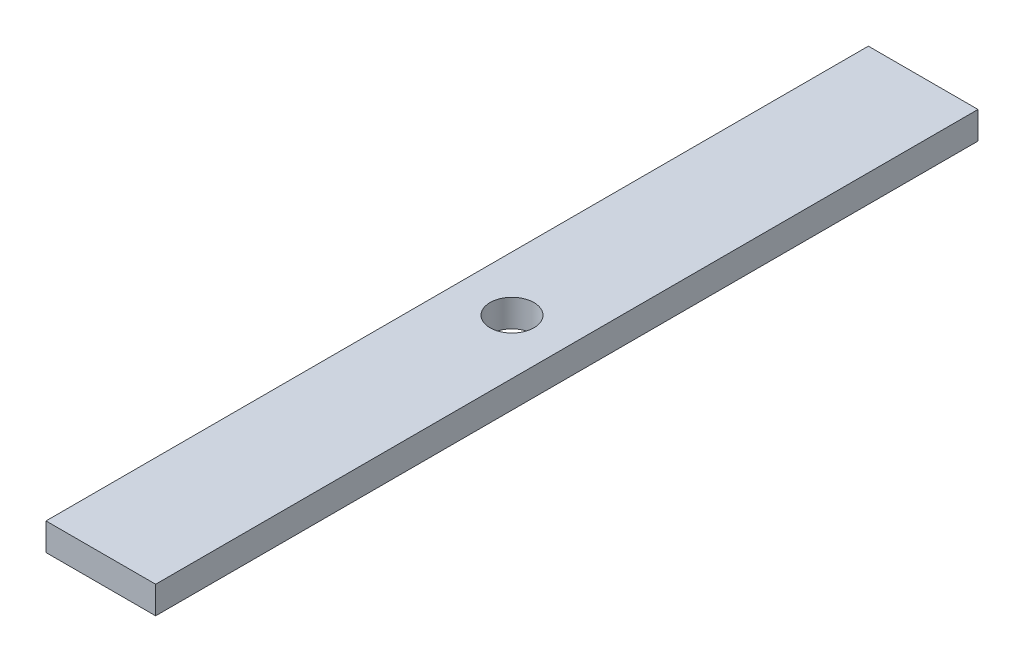
ISO-10303-21;
HEADER;
FILE_DESCRIPTION(('STEP AP214'),'2;1');
FILE_NAME('part.step','',(''),(''),'','','');
FILE_SCHEMA(('AUTOMOTIVE_DESIGN { 1 0 10303 214 1 1 1 1 }'));
ENDSEC;
DATA;
#1=APPLICATION_CONTEXT('core data for automotive mechanical design processes');
#2=APPLICATION_PROTOCOL_DEFINITION('international standard','automotive_design',2000,#1);
#3=PRODUCT_CONTEXT('',#1,'mechanical');
#4=PRODUCT('Part','Part','',(#3));
#5=PRODUCT_RELATED_PRODUCT_CATEGORY('part','',(#4));
#6=PRODUCT_DEFINITION_FORMATION('','',#4);
#7=PRODUCT_DEFINITION_CONTEXT('part definition',#1,'design');
#8=PRODUCT_DEFINITION('design','',#6,#7);
#9=PRODUCT_DEFINITION_SHAPE('','',#8);
#10=(LENGTH_UNIT() NAMED_UNIT(*) SI_UNIT(.MILLI.,.METRE.));
#11=(NAMED_UNIT(*) PLANE_ANGLE_UNIT() SI_UNIT($,.RADIAN.));
#12=(NAMED_UNIT(*) SI_UNIT($,.STERADIAN.) SOLID_ANGLE_UNIT());
#13=UNCERTAINTY_MEASURE_WITH_UNIT(LENGTH_MEASURE(1.E-05),#10,'distance_accuracy_value','');
#14=(GEOMETRIC_REPRESENTATION_CONTEXT(3) GLOBAL_UNCERTAINTY_ASSIGNED_CONTEXT((#13)) GLOBAL_UNIT_ASSIGNED_CONTEXT((#10,
#11,#12)) REPRESENTATION_CONTEXT('',''));
#15=CARTESIAN_POINT('',(0.,0.,0.));
#16=DIRECTION('',(0.,0.,1.));
#17=DIRECTION('',(1.,0.,0.));
#18=AXIS2_PLACEMENT_3D('',#15,#16,#17);
#19=CARTESIAN_POINT('',(-10.,2.5,106.));
#20=DIRECTION('',(1.,0.,0.));
#21=DIRECTION('',(0.,0.,-1.));
#22=AXIS2_PLACEMENT_3D('',#19,#20,#21);
#23=PLANE('',#22);
#24=DIRECTION('',(0.,-1.,0.));
#25=VECTOR('',#24,1.);
#26=CARTESIAN_POINT('',(-10.,2.5,75.));
#27=LINE('',#26,#25);
#28=CARTESIAN_POINT('',(-10.,2.5,75.));
#29=VERTEX_POINT('',#28);
#30=CARTESIAN_POINT('',(-10.,-2.5,75.));
#31=VERTEX_POINT('',#30);
#32=EDGE_CURVE('E73',#29,#31,#27,.T.);
#33=ORIENTED_EDGE('',*,*,#32,.F.);
#34=DIRECTION('',(0.,0.,-1.));
#35=VECTOR('',#34,1.);
#36=CARTESIAN_POINT('',(-10.,2.5,106.));
#37=LINE('',#36,#35);
#38=CARTESIAN_POINT('',(-10.,2.5,-75.));
#39=VERTEX_POINT('',#38);
#40=EDGE_CURVE('E85',#29,#39,#37,.T.);
#41=ORIENTED_EDGE('',*,*,#40,.T.);
#42=DIRECTION('',(0.,1.,0.));
#43=VECTOR('',#42,1.);
#44=CARTESIAN_POINT('',(-10.,2.5,-75.));
#45=LINE('',#44,#43);
#46=CARTESIAN_POINT('',(-10.,-2.5,-75.));
#47=VERTEX_POINT('',#46);
#48=EDGE_CURVE('E55',#47,#39,#45,.T.);
#49=ORIENTED_EDGE('',*,*,#48,.F.);
#50=DIRECTION('',(0.,0.,-1.));
#51=VECTOR('',#50,1.);
#52=CARTESIAN_POINT('',(-10.,-2.5,106.));
#53=LINE('',#52,#51);
#54=EDGE_CURVE('E12',#31,#47,#53,.T.);
#55=ORIENTED_EDGE('',*,*,#54,.F.);
#56=EDGE_LOOP('',(#33,#41,#49,#55));
#57=FACE_BOUND('',#56,.T.);
#58=ADVANCED_FACE('F33',(#57),#23,.F.);
#59=CARTESIAN_POINT('',(-10.,-2.5,106.));
#60=DIRECTION('',(0.,1.,0.));
#61=DIRECTION('',(-1.,0.,0.));
#62=AXIS2_PLACEMENT_3D('',#59,#60,#61);
#63=PLANE('',#62);
#64=CARTESIAN_POINT('',(0.,-2.5,0.));
#65=DIRECTION('',(0.,1.,0.));
#66=DIRECTION('',(-1.,0.,0.));
#67=AXIS2_PLACEMENT_3D('',#64,#65,#66);
#68=CIRCLE('',#67,4.);
#69=CARTESIAN_POINT('',(-4.,-2.5,0.));
#70=VERTEX_POINT('',#69);
#71=EDGE_CURVE('E90',#70,#70,#68,.T.);
#72=ORIENTED_EDGE('',*,*,#71,.T.);
#73=EDGE_LOOP('',(#72));
#74=FACE_BOUND('',#73,.T.);
#75=DIRECTION('',(1.,0.,0.));
#76=VECTOR('',#75,1.);
#77=CARTESIAN_POINT('',(-25.7525042215434,-2.5,75.));
#78=LINE('',#77,#76);
#79=CARTESIAN_POINT('',(9.99999999999998,-2.5,75.));
#80=VERTEX_POINT('',#79);
#81=EDGE_CURVE('E105',#31,#80,#78,.T.);
#82=ORIENTED_EDGE('',*,*,#81,.F.);
#83=ORIENTED_EDGE('',*,*,#54,.T.);
#84=DIRECTION('',(-1.,0.,0.));
#85=VECTOR('',#84,1.);
#86=CARTESIAN_POINT('',(-25.7525042215434,-2.5,-75.));
#87=LINE('',#86,#85);
#88=CARTESIAN_POINT('',(9.99999999999998,-2.5,-75.));
#89=VERTEX_POINT('',#88);
#90=EDGE_CURVE('E79',#89,#47,#87,.T.);
#91=ORIENTED_EDGE('',*,*,#90,.F.);
#92=DIRECTION('',(0.,0.,-1.));
#93=VECTOR('',#92,1.);
#94=CARTESIAN_POINT('',(10.,-2.5,106.));
#95=LINE('',#94,#93);
#96=EDGE_CURVE('E40',#80,#89,#95,.T.);
#97=ORIENTED_EDGE('',*,*,#96,.F.);
#98=EDGE_LOOP('',(#82,#83,#91,#97));
#99=FACE_BOUND('',#98,.T.);
#100=ADVANCED_FACE('F104',(#74,#99),#63,.F.);
#101=CARTESIAN_POINT('',(10.,2.5,106.));
#102=DIRECTION('',(-1.,0.,0.));
#103=DIRECTION('',(0.,0.,1.));
#104=AXIS2_PLACEMENT_3D('',#101,#102,#103);
#105=PLANE('',#104);
#106=DIRECTION('',(0.,1.,0.));
#107=VECTOR('',#106,1.);
#108=CARTESIAN_POINT('',(10.,2.5,75.));
#109=LINE('',#108,#107);
#110=CARTESIAN_POINT('',(10.,2.5,75.));
#111=VERTEX_POINT('',#110);
#112=EDGE_CURVE('E47',#80,#111,#109,.T.);
#113=ORIENTED_EDGE('',*,*,#112,.F.);
#114=ORIENTED_EDGE('',*,*,#96,.T.);
#115=DIRECTION('',(0.,-1.,0.));
#116=VECTOR('',#115,1.);
#117=CARTESIAN_POINT('',(10.,2.5,-75.));
#118=LINE('',#117,#116);
#119=CARTESIAN_POINT('',(9.99999999999998,2.5,-75.));
#120=VERTEX_POINT('',#119);
#121=EDGE_CURVE('E101',#120,#89,#118,.T.);
#122=ORIENTED_EDGE('',*,*,#121,.F.);
#123=DIRECTION('',(0.,0.,-1.));
#124=VECTOR('',#123,1.);
#125=CARTESIAN_POINT('',(10.,2.5,106.));
#126=LINE('',#125,#124);
#127=EDGE_CURVE('E89',#111,#120,#126,.T.);
#128=ORIENTED_EDGE('',*,*,#127,.F.);
#129=EDGE_LOOP('',(#113,#114,#122,#128));
#130=FACE_BOUND('',#129,.T.);
#131=ADVANCED_FACE('F100',(#130),#105,.F.);
#132=CARTESIAN_POINT('',(-10.,2.5,106.));
#133=DIRECTION('',(0.,-1.,0.));
#134=DIRECTION('',(1.,0.,0.));
#135=AXIS2_PLACEMENT_3D('',#132,#133,#134);
#136=PLANE('',#135);
#137=CARTESIAN_POINT('',(0.,2.5,0.));
#138=DIRECTION('',(0.,1.,0.));
#139=DIRECTION('',(-1.,0.,0.));
#140=AXIS2_PLACEMENT_3D('',#137,#138,#139);
#141=CIRCLE('',#140,4.);
#142=CARTESIAN_POINT('',(-4.,2.5,0.));
#143=VERTEX_POINT('',#142);
#144=EDGE_CURVE('E86',#143,#143,#141,.T.);
#145=ORIENTED_EDGE('',*,*,#144,.F.);
#146=EDGE_LOOP('',(#145));
#147=FACE_BOUND('',#146,.T.);
#148=DIRECTION('',(1.,0.,0.));
#149=VECTOR('',#148,1.);
#150=CARTESIAN_POINT('',(-25.7525042215434,2.5,75.));
#151=LINE('',#150,#149);
#152=EDGE_CURVE('E70',#29,#111,#151,.T.);
#153=ORIENTED_EDGE('',*,*,#152,.T.);
#154=ORIENTED_EDGE('',*,*,#127,.T.);
#155=DIRECTION('',(-1.,0.,0.));
#156=VECTOR('',#155,1.);
#157=CARTESIAN_POINT('',(-25.7525042215434,2.5,-75.));
#158=LINE('',#157,#156);
#159=EDGE_CURVE('E80',#120,#39,#158,.T.);
#160=ORIENTED_EDGE('',*,*,#159,.T.);
#161=ORIENTED_EDGE('',*,*,#40,.F.);
#162=EDGE_LOOP('',(#153,#154,#160,#161));
#163=FACE_BOUND('',#162,.T.);
#164=ADVANCED_FACE('F88',(#147,#163),#136,.F.);
#165=CARTESIAN_POINT('',(0.,-2.5,0.));
#166=DIRECTION('',(0.,1.,0.));
#167=DIRECTION('',(-1.,0.,0.));
#168=AXIS2_PLACEMENT_3D('',#165,#166,#167);
#169=CYLINDRICAL_SURFACE('',#168,4.);
#170=CARTESIAN_POINT('',(-4.,-2.5,0.));
#171=CARTESIAN_POINT('',(-4.,-2.44791666666667,0.));
#172=CARTESIAN_POINT('',(-4.,-2.39583333333333,0.));
#173=CARTESIAN_POINT('',(-4.,-2.29166666666667,0.));
#174=CARTESIAN_POINT('',(-4.,-2.23958333333333,0.));
#175=CARTESIAN_POINT('',(-4.,-2.13541666666667,0.));
#176=CARTESIAN_POINT('',(-4.,-2.08333333333333,0.));
#177=CARTESIAN_POINT('',(-4.,-1.97916666666667,0.));
#178=CARTESIAN_POINT('',(-4.,-1.92708333333333,0.));
#179=CARTESIAN_POINT('',(-4.,-1.82291666666667,0.));
#180=CARTESIAN_POINT('',(-4.,-1.77083333333333,0.));
#181=CARTESIAN_POINT('',(-4.,-1.66666666666667,0.));
#182=CARTESIAN_POINT('',(-4.,-1.61458333333333,0.));
#183=CARTESIAN_POINT('',(-4.,-1.51041666666667,0.));
#184=CARTESIAN_POINT('',(-4.,-1.45833333333333,0.));
#185=CARTESIAN_POINT('',(-4.,-1.35416666666667,0.));
#186=CARTESIAN_POINT('',(-4.,-1.30208333333333,0.));
#187=CARTESIAN_POINT('',(-4.,-1.19791666666667,0.));
#188=CARTESIAN_POINT('',(-4.,-1.14583333333333,0.));
#189=CARTESIAN_POINT('',(-4.,-1.04166666666667,0.));
#190=CARTESIAN_POINT('',(-4.,-0.989583333333334,0.));
#191=CARTESIAN_POINT('',(-4.,-0.885416666666667,0.));
#192=CARTESIAN_POINT('',(-4.,-0.833333333333334,0.));
#193=CARTESIAN_POINT('',(-4.,-0.729166666666667,0.));
#194=CARTESIAN_POINT('',(-4.,-0.677083333333334,0.));
#195=CARTESIAN_POINT('',(-4.,-0.572916666666667,0.));
#196=CARTESIAN_POINT('',(-4.,-0.520833333333334,0.));
#197=CARTESIAN_POINT('',(-4.,-0.416666666666667,0.));
#198=CARTESIAN_POINT('',(-4.,-0.364583333333334,0.));
#199=CARTESIAN_POINT('',(-4.,-0.260416666666667,0.));
#200=CARTESIAN_POINT('',(-4.,-0.208333333333334,0.));
#201=CARTESIAN_POINT('',(-4.,-0.104166666666667,0.));
#202=CARTESIAN_POINT('',(-4.,-0.0520833333333334,0.));
#203=CARTESIAN_POINT('',(-4.,0.0520833333333334,0.));
#204=CARTESIAN_POINT('',(-4.,0.104166666666667,0.));
#205=CARTESIAN_POINT('',(-4.,0.208333333333334,0.));
#206=CARTESIAN_POINT('',(-4.,0.260416666666667,0.));
#207=CARTESIAN_POINT('',(-4.,0.364583333333334,0.));
#208=CARTESIAN_POINT('',(-4.,0.416666666666667,0.));
#209=CARTESIAN_POINT('',(-4.,0.520833333333334,0.));
#210=CARTESIAN_POINT('',(-4.,0.572916666666667,0.));
#211=CARTESIAN_POINT('',(-4.,0.677083333333334,0.));
#212=CARTESIAN_POINT('',(-4.,0.729166666666667,0.));
#213=CARTESIAN_POINT('',(-4.,0.833333333333334,0.));
#214=CARTESIAN_POINT('',(-4.,0.885416666666667,0.));
#215=CARTESIAN_POINT('',(-4.,0.989583333333334,0.));
#216=CARTESIAN_POINT('',(-4.,1.04166666666667,0.));
#217=CARTESIAN_POINT('',(-4.,1.14583333333333,0.));
#218=CARTESIAN_POINT('',(-4.,1.19791666666667,0.));
#219=CARTESIAN_POINT('',(-4.,1.30208333333333,0.));
#220=CARTESIAN_POINT('',(-4.,1.35416666666667,0.));
#221=CARTESIAN_POINT('',(-4.,1.45833333333333,0.));
#222=CARTESIAN_POINT('',(-4.,1.51041666666667,0.));
#223=CARTESIAN_POINT('',(-4.,1.61458333333333,0.));
#224=CARTESIAN_POINT('',(-4.,1.66666666666667,0.));
#225=CARTESIAN_POINT('',(-4.,1.77083333333333,0.));
#226=CARTESIAN_POINT('',(-4.,1.82291666666667,0.));
#227=CARTESIAN_POINT('',(-4.,1.92708333333333,0.));
#228=CARTESIAN_POINT('',(-4.,1.97916666666667,0.));
#229=CARTESIAN_POINT('',(-4.,2.08333333333333,0.));
#230=CARTESIAN_POINT('',(-4.,2.13541666666667,0.));
#231=CARTESIAN_POINT('',(-4.,2.23958333333333,0.));
#232=CARTESIAN_POINT('',(-4.,2.29166666666667,0.));
#233=CARTESIAN_POINT('',(-4.,2.39583333333333,0.));
#234=CARTESIAN_POINT('',(-4.,2.44791666666667,0.));
#235=CARTESIAN_POINT('',(-4.,2.5,0.));
#236=B_SPLINE_CURVE_WITH_KNOTS('',3,(#170,#171,#172,#173,#174,#175,#176,#177,#178,#179,#180,
#181,#182,#183,#184,#185,#186,#187,#188,#189,#190,#191,#192,#193,#194,#195,#196,#197,#198,#199,
#200,#201,#202,#203,#204,#205,#206,#207,#208,#209,#210,#211,#212,#213,#214,#215,#216,#217,#218,
#219,#220,#221,#222,#223,#224,#225,#226,#227,#228,#229,#230,#231,#232,#233,#234,#235),
.UNSPECIFIED.,.F.,.F.,(4,2,2,2,2,2,2,2,2,2,2,2,2,2,2,2,2,2,2,2,2,2,2,2,2,2,2,2,2,2,2,2,4),(0.,
0.15625,0.3125,0.46875,0.625,0.78125,0.9375,1.09375,1.25,1.40625,1.5625,1.71875,1.875,2.03125,
2.1875,2.34375,2.5,2.65625,2.8125,2.96875,3.125,3.28125,3.4375,3.59375,3.75,3.90625,4.0625,
4.21875,4.375,4.53125,4.6875,4.84375,5.),.UNSPECIFIED.);
#237=EDGE_CURVE('BSEAM114',#70,#143,#236,.T.);
#238=ORIENTED_EDGE('',*,*,#71,.F.);
#239=ORIENTED_EDGE('',*,*,#144,.T.);
#240=ORIENTED_EDGE('',*,*,#237,.T.);
#241=ORIENTED_EDGE('',*,*,#237,.F.);
#242=EDGE_LOOP('',(#238,#240,#239,#241));
#243=FACE_BOUND('',#242,.T.);
#244=ADVANCED_FACE('F114',(#243),#169,.F.);
#245=CARTESIAN_POINT('',(-25.7525042215434,-2.5,-75.));
#246=DIRECTION('',(0.,0.,-1.));
#247=DIRECTION('',(-1.,0.,0.));
#248=AXIS2_PLACEMENT_3D('',#245,#246,#247);
#249=PLANE('',#248);
#250=ORIENTED_EDGE('',*,*,#48,.T.);
#251=ORIENTED_EDGE('',*,*,#159,.F.);
#252=ORIENTED_EDGE('',*,*,#121,.T.);
#253=ORIENTED_EDGE('',*,*,#90,.T.);
#254=EDGE_LOOP('',(#250,#251,#252,#253));
#255=FACE_BOUND('',#254,.T.);
#256=ADVANCED_FACE('F112',(#255),#249,.T.);
#257=CARTESIAN_POINT('',(-25.7525042215434,-2.5,75.));
#258=DIRECTION('',(0.,0.,1.));
#259=DIRECTION('',(1.,0.,0.));
#260=AXIS2_PLACEMENT_3D('',#257,#258,#259);
#261=PLANE('',#260);
#262=ORIENTED_EDGE('',*,*,#32,.T.);
#263=ORIENTED_EDGE('',*,*,#81,.T.);
#264=ORIENTED_EDGE('',*,*,#112,.T.);
#265=ORIENTED_EDGE('',*,*,#152,.F.);
#266=EDGE_LOOP('',(#262,#263,#264,#265));
#267=FACE_BOUND('',#266,.T.);
#268=ADVANCED_FACE('F72',(#267),#261,.T.);
#269=CLOSED_SHELL('',(#58,#100,#131,#164,#244,#256,#268));
#270=MANIFOLD_SOLID_BREP('B2',#269);
#271=ADVANCED_BREP_SHAPE_REPRESENTATION('',(#18,#270),#14);
#272=SHAPE_DEFINITION_REPRESENTATION(#9,#271);
ENDSEC;
END-ISO-10303-21;
